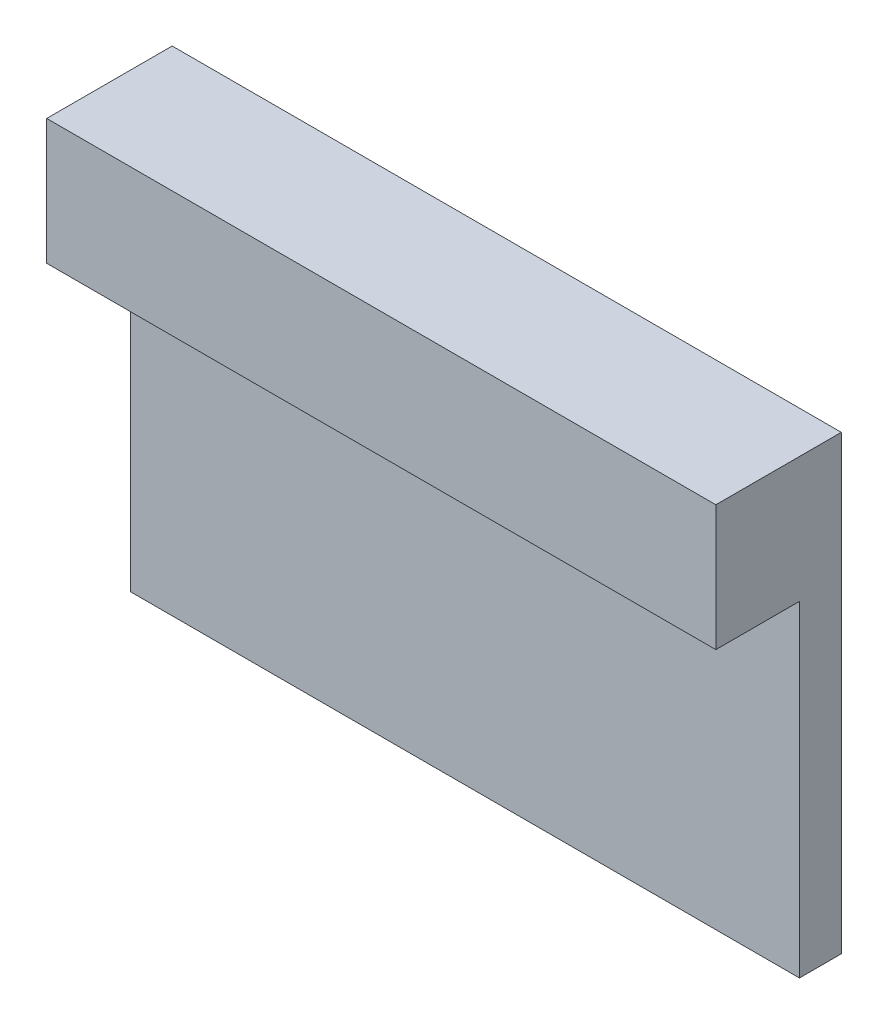
ISO-10303-21;
HEADER;
FILE_DESCRIPTION(('STEP AP214'),'2;1');
FILE_NAME('part.step','',(''),(''),'','','');
FILE_SCHEMA(('AUTOMOTIVE_DESIGN { 1 0 10303 214 1 1 1 1 }'));
ENDSEC;
DATA;
#1=APPLICATION_CONTEXT('core data for automotive mechanical design processes');
#2=APPLICATION_PROTOCOL_DEFINITION('international standard','automotive_design',2000,#1);
#3=PRODUCT_CONTEXT('',#1,'mechanical');
#4=PRODUCT('Part','Part','',(#3));
#5=PRODUCT_RELATED_PRODUCT_CATEGORY('part','',(#4));
#6=PRODUCT_DEFINITION_FORMATION('','',#4);
#7=PRODUCT_DEFINITION_CONTEXT('part definition',#1,'design');
#8=PRODUCT_DEFINITION('design','',#6,#7);
#9=PRODUCT_DEFINITION_SHAPE('','',#8);
#10=(LENGTH_UNIT() NAMED_UNIT(*) SI_UNIT(.MILLI.,.METRE.));
#11=(NAMED_UNIT(*) PLANE_ANGLE_UNIT() SI_UNIT($,.RADIAN.));
#12=(NAMED_UNIT(*) SI_UNIT($,.STERADIAN.) SOLID_ANGLE_UNIT());
#13=UNCERTAINTY_MEASURE_WITH_UNIT(LENGTH_MEASURE(1.E-05),#10,'distance_accuracy_value','');
#14=(GEOMETRIC_REPRESENTATION_CONTEXT(3) GLOBAL_UNCERTAINTY_ASSIGNED_CONTEXT((#13)) GLOBAL_UNIT_ASSIGNED_CONTEXT((#10,
#11,#12)) REPRESENTATION_CONTEXT('',''));
#15=CARTESIAN_POINT('',(0.,0.,0.));
#16=DIRECTION('',(0.,0.,1.));
#17=DIRECTION('',(1.,0.,0.));
#18=AXIS2_PLACEMENT_3D('',#15,#16,#17);
#19=CARTESIAN_POINT('',(192.820049601544,0.,10.));
#20=DIRECTION('',(1.,0.,0.));
#21=DIRECTION('',(0.,0.,-1.));
#22=AXIS2_PLACEMENT_3D('',#19,#20,#21);
#23=PLANE('',#22);
#24=DIRECTION('',(0.,-1.,0.));
#25=VECTOR('',#24,1.);
#26=CARTESIAN_POINT('',(192.820049601544,0.,0.));
#27=LINE('',#26,#25);
#28=CARTESIAN_POINT('',(192.820049601544,90.8811871123274,0.));
#29=VERTEX_POINT('',#28);
#30=CARTESIAN_POINT('',(192.820049601544,-17.1188128876726,0.));
#31=VERTEX_POINT('',#30);
#32=EDGE_CURVE('E114',#29,#31,#27,.T.);
#33=ORIENTED_EDGE('',*,*,#32,.F.);
#34=DIRECTION('',(0.,0.,-1.));
#35=VECTOR('',#34,1.);
#36=CARTESIAN_POINT('',(192.820049601544,90.8811871123274,30.));
#37=LINE('',#36,#35);
#38=CARTESIAN_POINT('',(192.820049601544,90.8811871123274,30.));
#39=VERTEX_POINT('',#38);
#40=EDGE_CURVE('E101',#39,#29,#37,.T.);
#41=ORIENTED_EDGE('',*,*,#40,.F.);
#42=DIRECTION('',(0.,-1.,0.));
#43=VECTOR('',#42,1.);
#44=CARTESIAN_POINT('',(192.820049601544,0.,30.));
#45=LINE('',#44,#43);
#46=CARTESIAN_POINT('',(192.820049601544,60.8811871123274,30.));
#47=VERTEX_POINT('',#46);
#48=EDGE_CURVE('E137',#39,#47,#45,.T.);
#49=ORIENTED_EDGE('',*,*,#48,.T.);
#50=DIRECTION('',(0.,0.,-1.));
#51=VECTOR('',#50,1.);
#52=CARTESIAN_POINT('',(192.820049601544,60.8811871123274,30.));
#53=LINE('',#52,#51);
#54=CARTESIAN_POINT('',(192.820049601544,60.8811871123274,10.));
#55=VERTEX_POINT('',#54);
#56=EDGE_CURVE('E99',#47,#55,#53,.T.);
#57=ORIENTED_EDGE('',*,*,#56,.T.);
#58=DIRECTION('',(0.,-1.,0.));
#59=VECTOR('',#58,1.);
#60=CARTESIAN_POINT('',(192.820049601544,0.,10.));
#61=LINE('',#60,#59);
#62=CARTESIAN_POINT('',(192.820049601544,-17.1188128876726,10.));
#63=VERTEX_POINT('',#62);
#64=EDGE_CURVE('E74',#55,#63,#61,.T.);
#65=ORIENTED_EDGE('',*,*,#64,.T.);
#66=DIRECTION('',(0.,0.,-1.));
#67=VECTOR('',#66,1.);
#68=CARTESIAN_POINT('',(192.820049601544,-17.1188128876726,10.));
#69=LINE('',#68,#67);
#70=EDGE_CURVE('E47',#63,#31,#69,.T.);
#71=ORIENTED_EDGE('',*,*,#70,.T.);
#72=EDGE_LOOP('',(#33,#41,#49,#57,#65,#71));
#73=FACE_BOUND('',#72,.T.);
#74=ADVANCED_FACE('F38',(#73),#23,.T.);
#75=CARTESIAN_POINT('',(32.8200496015445,0.,10.));
#76=DIRECTION('',(1.,0.,0.));
#77=DIRECTION('',(0.,1.,0.));
#78=AXIS2_PLACEMENT_3D('',#75,#76,#77);
#79=PLANE('',#78);
#80=DIRECTION('',(0.,-1.,0.));
#81=VECTOR('',#80,1.);
#82=CARTESIAN_POINT('',(32.8200496015445,0.,0.));
#83=LINE('',#82,#81);
#84=CARTESIAN_POINT('',(32.8200496015445,90.8811871123274,0.));
#85=VERTEX_POINT('',#84);
#86=CARTESIAN_POINT('',(32.8200496015445,-17.1188128876726,0.));
#87=VERTEX_POINT('',#86);
#88=EDGE_CURVE('E68',#85,#87,#83,.T.);
#89=ORIENTED_EDGE('',*,*,#88,.T.);
#90=DIRECTION('',(0.,0.,-1.));
#91=VECTOR('',#90,1.);
#92=CARTESIAN_POINT('',(32.8200496015445,-17.1188128876726,10.));
#93=LINE('',#92,#91);
#94=CARTESIAN_POINT('',(32.8200496015445,-17.1188128876726,10.));
#95=VERTEX_POINT('',#94);
#96=EDGE_CURVE('E11',#95,#87,#93,.T.);
#97=ORIENTED_EDGE('',*,*,#96,.F.);
#98=DIRECTION('',(0.,-1.,0.));
#99=VECTOR('',#98,1.);
#100=CARTESIAN_POINT('',(32.8200496015445,0.,10.));
#101=LINE('',#100,#99);
#102=CARTESIAN_POINT('',(32.8200496015445,60.8811871123274,10.));
#103=VERTEX_POINT('',#102);
#104=EDGE_CURVE('E84',#103,#95,#101,.T.);
#105=ORIENTED_EDGE('',*,*,#104,.F.);
#106=DIRECTION('',(0.,0.,-1.));
#107=VECTOR('',#106,1.);
#108=CARTESIAN_POINT('',(32.8200496015445,60.8811871123274,30.));
#109=LINE('',#108,#107);
#110=CARTESIAN_POINT('',(32.8200496015445,60.8811871123274,30.));
#111=VERTEX_POINT('',#110);
#112=EDGE_CURVE('E88',#111,#103,#109,.T.);
#113=ORIENTED_EDGE('',*,*,#112,.F.);
#114=DIRECTION('',(0.,-1.,0.));
#115=VECTOR('',#114,1.);
#116=CARTESIAN_POINT('',(32.8200496015445,0.,30.));
#117=LINE('',#116,#115);
#118=CARTESIAN_POINT('',(32.8200496015445,90.8811871123274,30.));
#119=VERTEX_POINT('',#118);
#120=EDGE_CURVE('E144',#119,#111,#117,.T.);
#121=ORIENTED_EDGE('',*,*,#120,.F.);
#122=DIRECTION('',(0.,0.,-1.));
#123=VECTOR('',#122,1.);
#124=CARTESIAN_POINT('',(32.8200496015445,90.8811871123274,30.));
#125=LINE('',#124,#123);
#126=EDGE_CURVE('E98',#119,#85,#125,.T.);
#127=ORIENTED_EDGE('',*,*,#126,.T.);
#128=EDGE_LOOP('',(#89,#97,#105,#113,#121,#127));
#129=FACE_BOUND('',#128,.T.);
#130=ADVANCED_FACE('F85',(#129),#79,.F.);
#131=CARTESIAN_POINT('',(0.,-17.1188128876726,10.));
#132=DIRECTION('',(0.,1.,0.));
#133=DIRECTION('',(-1.,0.,0.));
#134=AXIS2_PLACEMENT_3D('',#131,#132,#133);
#135=PLANE('',#134);
#136=DIRECTION('',(1.,0.,0.));
#137=VECTOR('',#136,1.);
#138=CARTESIAN_POINT('',(0.,-17.1188128876726,0.));
#139=LINE('',#138,#137);
#140=EDGE_CURVE('E126',#87,#31,#139,.T.);
#141=ORIENTED_EDGE('',*,*,#140,.T.);
#142=ORIENTED_EDGE('',*,*,#70,.F.);
#143=DIRECTION('',(1.,0.,0.));
#144=VECTOR('',#143,1.);
#145=CARTESIAN_POINT('',(0.,-17.1188128876726,10.));
#146=LINE('',#145,#144);
#147=EDGE_CURVE('E56',#95,#63,#146,.T.);
#148=ORIENTED_EDGE('',*,*,#147,.F.);
#149=ORIENTED_EDGE('',*,*,#96,.T.);
#150=EDGE_LOOP('',(#141,#142,#148,#149));
#151=FACE_BOUND('',#150,.T.);
#152=ADVANCED_FACE('F157',(#151),#135,.F.);
#153=CARTESIAN_POINT('',(0.,0.,10.));
#154=DIRECTION('',(0.,0.,1.));
#155=DIRECTION('',(1.,0.,0.));
#156=AXIS2_PLACEMENT_3D('',#153,#154,#155);
#157=PLANE('',#156);
#158=ORIENTED_EDGE('',*,*,#64,.F.);
#159=DIRECTION('',(1.,0.,0.));
#160=VECTOR('',#159,1.);
#161=CARTESIAN_POINT('',(0.,60.8811871123274,10.));
#162=LINE('',#161,#160);
#163=EDGE_CURVE('E90',#103,#55,#162,.T.);
#164=ORIENTED_EDGE('',*,*,#163,.F.);
#165=ORIENTED_EDGE('',*,*,#104,.T.);
#166=ORIENTED_EDGE('',*,*,#147,.T.);
#167=EDGE_LOOP('',(#158,#164,#165,#166));
#168=FACE_BOUND('',#167,.T.);
#169=ADVANCED_FACE('F91',(#168),#157,.T.);
#170=CARTESIAN_POINT('',(0.,0.,0.));
#171=DIRECTION('',(0.,0.,1.));
#172=DIRECTION('',(1.,0.,0.));
#173=AXIS2_PLACEMENT_3D('',#170,#171,#172);
#174=PLANE('',#173);
#175=ORIENTED_EDGE('',*,*,#32,.T.);
#176=ORIENTED_EDGE('',*,*,#140,.F.);
#177=ORIENTED_EDGE('',*,*,#88,.F.);
#178=DIRECTION('',(1.,0.,0.));
#179=VECTOR('',#178,1.);
#180=CARTESIAN_POINT('',(0.,90.8811871123274,0.));
#181=LINE('',#180,#179);
#182=EDGE_CURVE('E142',#85,#29,#181,.T.);
#183=ORIENTED_EDGE('',*,*,#182,.T.);
#184=EDGE_LOOP('',(#175,#176,#177,#183));
#185=FACE_BOUND('',#184,.T.);
#186=ADVANCED_FACE('F155',(#185),#174,.F.);
#187=CARTESIAN_POINT('',(0.,60.8811871123274,30.));
#188=DIRECTION('',(0.,1.,0.));
#189=DIRECTION('',(0.,0.,1.));
#190=AXIS2_PLACEMENT_3D('',#187,#188,#189);
#191=PLANE('',#190);
#192=ORIENTED_EDGE('',*,*,#112,.T.);
#193=ORIENTED_EDGE('',*,*,#163,.T.);
#194=ORIENTED_EDGE('',*,*,#56,.F.);
#195=DIRECTION('',(1.,0.,0.));
#196=VECTOR('',#195,1.);
#197=CARTESIAN_POINT('',(0.,60.8811871123274,30.));
#198=LINE('',#197,#196);
#199=EDGE_CURVE('E97',#111,#47,#198,.T.);
#200=ORIENTED_EDGE('',*,*,#199,.F.);
#201=EDGE_LOOP('',(#192,#193,#194,#200));
#202=FACE_BOUND('',#201,.T.);
#203=ADVANCED_FACE('F96',(#202),#191,.F.);
#204=CARTESIAN_POINT('',(0.,90.8811871123274,30.));
#205=DIRECTION('',(0.,1.,0.));
#206=DIRECTION('',(0.,0.,1.));
#207=AXIS2_PLACEMENT_3D('',#204,#205,#206);
#208=PLANE('',#207);
#209=ORIENTED_EDGE('',*,*,#182,.F.);
#210=ORIENTED_EDGE('',*,*,#126,.F.);
#211=DIRECTION('',(1.,0.,0.));
#212=VECTOR('',#211,1.);
#213=CARTESIAN_POINT('',(0.,90.8811871123274,30.));
#214=LINE('',#213,#212);
#215=EDGE_CURVE('E141',#119,#39,#214,.T.);
#216=ORIENTED_EDGE('',*,*,#215,.T.);
#217=ORIENTED_EDGE('',*,*,#40,.T.);
#218=EDGE_LOOP('',(#209,#210,#216,#217));
#219=FACE_BOUND('',#218,.T.);
#220=ADVANCED_FACE('F195',(#219),#208,.T.);
#221=CARTESIAN_POINT('',(0.,0.,30.));
#222=DIRECTION('',(0.,0.,1.));
#223=DIRECTION('',(1.,0.,0.));
#224=AXIS2_PLACEMENT_3D('',#221,#222,#223);
#225=PLANE('',#224);
#226=ORIENTED_EDGE('',*,*,#48,.F.);
#227=ORIENTED_EDGE('',*,*,#215,.F.);
#228=ORIENTED_EDGE('',*,*,#120,.T.);
#229=ORIENTED_EDGE('',*,*,#199,.T.);
#230=EDGE_LOOP('',(#226,#227,#228,#229));
#231=FACE_BOUND('',#230,.T.);
#232=ADVANCED_FACE('F149',(#231),#225,.T.);
#233=CLOSED_SHELL('',(#74,#130,#152,#169,#186,#203,#220,#232));
#234=MANIFOLD_SOLID_BREP('B2',#233);
#235=ADVANCED_BREP_SHAPE_REPRESENTATION('',(#18,#234),#14);
#236=SHAPE_DEFINITION_REPRESENTATION(#9,#235);
ENDSEC;
END-ISO-10303-21;
